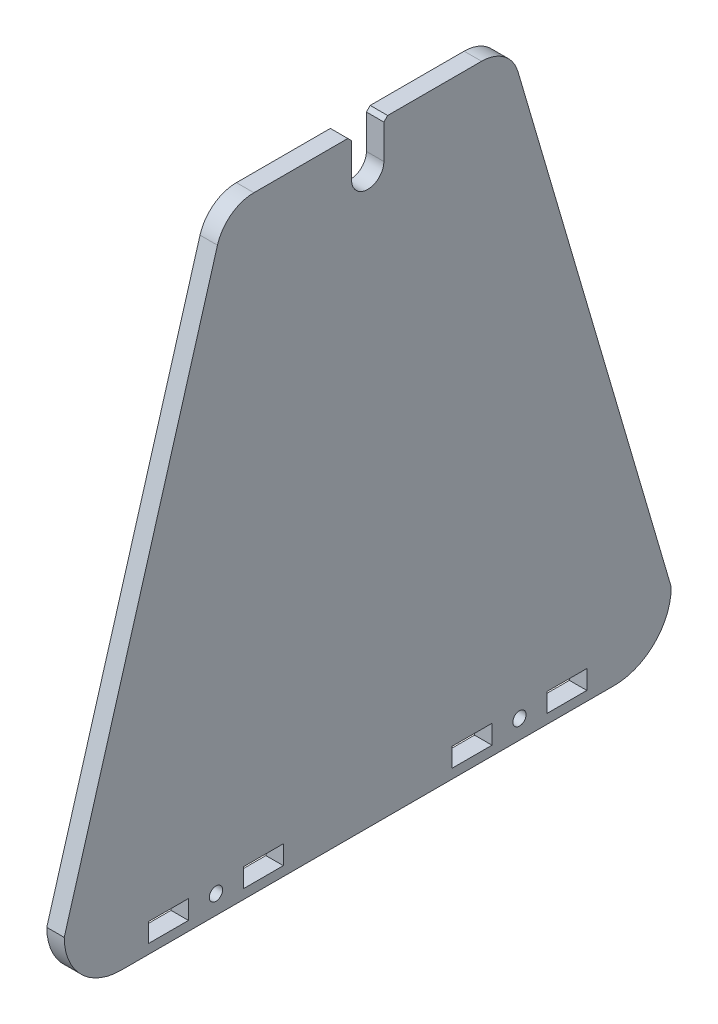
ISO-10303-21;
HEADER;
FILE_DESCRIPTION(('STEP AP214'),'2;1');
FILE_NAME('part.step','',(''),(''),'','','');
FILE_SCHEMA(('AUTOMOTIVE_DESIGN { 1 0 10303 214 1 1 1 1 }'));
ENDSEC;
DATA;
#1=APPLICATION_CONTEXT('core data for automotive mechanical design processes');
#2=APPLICATION_PROTOCOL_DEFINITION('international standard','automotive_design',2000,#1);
#3=PRODUCT_CONTEXT('',#1,'mechanical');
#4=PRODUCT('Part','Part','',(#3));
#5=PRODUCT_RELATED_PRODUCT_CATEGORY('part','',(#4));
#6=PRODUCT_DEFINITION_FORMATION('','',#4);
#7=PRODUCT_DEFINITION_CONTEXT('part definition',#1,'design');
#8=PRODUCT_DEFINITION('design','',#6,#7);
#9=PRODUCT_DEFINITION_SHAPE('','',#8);
#10=(LENGTH_UNIT() NAMED_UNIT(*) SI_UNIT(.MILLI.,.METRE.));
#11=(NAMED_UNIT(*) PLANE_ANGLE_UNIT() SI_UNIT($,.RADIAN.));
#12=(NAMED_UNIT(*) SI_UNIT($,.STERADIAN.) SOLID_ANGLE_UNIT());
#13=UNCERTAINTY_MEASURE_WITH_UNIT(LENGTH_MEASURE(1.E-05),#10,'distance_accuracy_value','');
#14=(GEOMETRIC_REPRESENTATION_CONTEXT(3) GLOBAL_UNCERTAINTY_ASSIGNED_CONTEXT((#13)) GLOBAL_UNIT_ASSIGNED_CONTEXT((#10,
#11,#12)) REPRESENTATION_CONTEXT('',''));
#15=CARTESIAN_POINT('',(0.,0.,0.));
#16=DIRECTION('',(0.,0.,1.));
#17=DIRECTION('',(1.,0.,0.));
#18=AXIS2_PLACEMENT_3D('',#15,#16,#17);
#19=CARTESIAN_POINT('',(4.6,19.9939194911048,-20.0034113777652));
#20=DIRECTION('',(1.,0.,0.));
#21=DIRECTION('',(0.,0.,-1.));
#22=AXIS2_PLACEMENT_3D('',#19,#20,#21);
#23=PLANE('',#22);
#24=DIRECTION('',(0.,0.,-1.));
#25=VECTOR('',#24,1.);
#26=CARTESIAN_POINT('',(4.6,7.49391949110479,-107.253411377765));
#27=LINE('',#26,#25);
#28=CARTESIAN_POINT('',(4.6,7.49391949110479,-107.253411377765));
#29=VERTEX_POINT('',#28);
#30=CARTESIAN_POINT('',(4.6,7.49391949110479,-117.753411377765));
#31=VERTEX_POINT('',#30);
#32=EDGE_CURVE('E239',#29,#31,#27,.T.);
#33=ORIENTED_EDGE('',*,*,#32,.F.);
#34=DIRECTION('',(0.,-1.,0.));
#35=VECTOR('',#34,1.);
#36=CARTESIAN_POINT('',(4.6,12.4939194911048,-107.253411377765));
#37=LINE('',#36,#35);
#38=CARTESIAN_POINT('',(4.6,12.4939194911048,-107.253411377765));
#39=VERTEX_POINT('',#38);
#40=EDGE_CURVE('E231',#39,#29,#37,.T.);
#41=ORIENTED_EDGE('',*,*,#40,.F.);
#42=DIRECTION('',(0.,0.,1.));
#43=VECTOR('',#42,1.);
#44=CARTESIAN_POINT('',(4.6,12.4939194911048,-117.753411377765));
#45=LINE('',#44,#43);
#46=CARTESIAN_POINT('',(4.6,12.4939194911048,-117.753411377765));
#47=VERTEX_POINT('',#46);
#48=EDGE_CURVE('E254',#47,#39,#45,.T.);
#49=ORIENTED_EDGE('',*,*,#48,.F.);
#50=DIRECTION('',(0.,1.,0.));
#51=VECTOR('',#50,1.);
#52=CARTESIAN_POINT('',(4.6,7.49391949110479,-117.753411377765));
#53=LINE('',#52,#51);
#54=EDGE_CURVE('E252',#31,#47,#53,.T.);
#55=ORIENTED_EDGE('',*,*,#54,.F.);
#56=EDGE_LOOP('',(#33,#41,#49,#55));
#57=FACE_BOUND('',#56,.T.);
#58=CARTESIAN_POINT('',(4.6,9.99391949110479,-45.0034113777653));
#59=DIRECTION('',(1.,0.,0.));
#60=DIRECTION('',(0.,0.,-1.));
#61=AXIS2_PLACEMENT_3D('',#58,#59,#60);
#62=CIRCLE('',#61,1.75);
#63=CARTESIAN_POINT('',(4.6,9.99391949110479,-46.7534113777653));
#64=VERTEX_POINT('',#63);
#65=EDGE_CURVE('E301',#64,#64,#62,.T.);
#66=ORIENTED_EDGE('',*,*,#65,.F.);
#67=EDGE_LOOP('',(#66));
#68=FACE_BOUND('',#67,.T.);
#69=DIRECTION('',(0.,0.,-1.));
#70=VECTOR('',#69,1.);
#71=CARTESIAN_POINT('',(4.6,7.49391949110479,-27.2534113777653));
#72=LINE('',#71,#70);
#73=CARTESIAN_POINT('',(4.6,7.49391949110479,-27.2534113777653));
#74=VERTEX_POINT('',#73);
#75=CARTESIAN_POINT('',(4.6,7.49391949110479,-37.7534113777653));
#76=VERTEX_POINT('',#75);
#77=EDGE_CURVE('E340',#74,#76,#72,.T.);
#78=ORIENTED_EDGE('',*,*,#77,.F.);
#79=DIRECTION('',(0.,-1.,0.));
#80=VECTOR('',#79,1.);
#81=CARTESIAN_POINT('',(4.6,12.4939194911048,-27.2534113777653));
#82=LINE('',#81,#80);
#83=CARTESIAN_POINT('',(4.6,12.4939194911048,-27.2534113777653));
#84=VERTEX_POINT('',#83);
#85=EDGE_CURVE('E338',#84,#74,#82,.T.);
#86=ORIENTED_EDGE('',*,*,#85,.F.);
#87=DIRECTION('',(0.,0.,1.));
#88=VECTOR('',#87,1.);
#89=CARTESIAN_POINT('',(4.6,12.4939194911048,-37.7534113777653));
#90=LINE('',#89,#88);
#91=CARTESIAN_POINT('',(4.6,12.4939194911048,-37.7534113777653));
#92=VERTEX_POINT('',#91);
#93=EDGE_CURVE('E346',#92,#84,#90,.T.);
#94=ORIENTED_EDGE('',*,*,#93,.F.);
#95=DIRECTION('',(0.,1.,0.));
#96=VECTOR('',#95,1.);
#97=CARTESIAN_POINT('',(4.6,7.49391949110479,-37.7534113777653));
#98=LINE('',#97,#96);
#99=EDGE_CURVE('E343',#76,#92,#98,.T.);
#100=ORIENTED_EDGE('',*,*,#99,.F.);
#101=EDGE_LOOP('',(#78,#86,#94,#100));
#102=FACE_BOUND('',#101,.T.);
#103=CARTESIAN_POINT('',(4.6,19.9939194911048,-20.0034113777652));
#104=DIRECTION('',(1.,0.,0.));
#105=DIRECTION('',(0.,0.,-1.));
#106=AXIS2_PLACEMENT_3D('',#103,#104,#105);
#107=CIRCLE('',#106,15.);
#108=CARTESIAN_POINT('',(4.6,19.9939194911048,-5.00341137776519));
#109=VERTEX_POINT('',#108);
#110=CARTESIAN_POINT('',(4.6,4.99391949110479,-20.0034113777652));
#111=VERTEX_POINT('',#110);
#112=EDGE_CURVE('E369',#109,#111,#107,.T.);
#113=ORIENTED_EDGE('',*,*,#112,.T.);
#114=DIRECTION('',(0.,0.,-1.));
#115=VECTOR('',#114,1.);
#116=CARTESIAN_POINT('',(4.6,4.99391949110479,-20.0034113777652));
#117=LINE('',#116,#115);
#118=CARTESIAN_POINT('',(4.6,4.99391949110478,-150.003411377766));
#119=VERTEX_POINT('',#118);
#120=EDGE_CURVE('E372',#111,#119,#117,.T.);
#121=ORIENTED_EDGE('',*,*,#120,.T.);
#122=CARTESIAN_POINT('',(4.6,19.9939194911048,-150.003411377766));
#123=DIRECTION('',(1.,0.,0.));
#124=DIRECTION('',(0.,0.,-1.));
#125=AXIS2_PLACEMENT_3D('',#122,#123,#124);
#126=CIRCLE('',#125,15.);
#127=CARTESIAN_POINT('',(4.6,19.9939194911048,-165.003411377766));
#128=VERTEX_POINT('',#127);
#129=EDGE_CURVE('E375',#119,#128,#126,.T.);
#130=ORIENTED_EDGE('',*,*,#129,.T.);
#131=DIRECTION('',(0.,0.959628543885213,0.281270435276702));
#132=VECTOR('',#131,1.);
#133=CARTESIAN_POINT('',(4.6,19.9939194911048,-165.003411377766));
#134=LINE('',#133,#132);
#135=CARTESIAN_POINT('',(4.6,157.806623843872,-124.610032515747));
#136=VERTEX_POINT('',#135);
#137=EDGE_CURVE('E377',#128,#136,#134,.T.);
#138=ORIENTED_EDGE('',*,*,#137,.T.);
#139=CARTESIAN_POINT('',(4.6,154.993919491105,-115.013747076895));
#140=DIRECTION('',(1.,0.,0.));
#141=DIRECTION('',(0.,0.,-1.));
#142=AXIS2_PLACEMENT_3D('',#139,#140,#141);
#143=CIRCLE('',#142,9.99999999999996);
#144=CARTESIAN_POINT('',(4.6,164.993919491105,-115.013747076895));
#145=VERTEX_POINT('',#144);
#146=EDGE_CURVE('E379',#136,#145,#143,.T.);
#147=ORIENTED_EDGE('',*,*,#146,.T.);
#148=DIRECTION('',(0.,0.,1.));
#149=VECTOR('',#148,1.);
#150=CARTESIAN_POINT('',(4.6,164.993919491105,-115.013747076895));
#151=LINE('',#150,#149);
#152=CARTESIAN_POINT('',(4.6,164.993919491105,-90.2534113777653));
#153=VERTEX_POINT('',#152);
#154=EDGE_CURVE('E381',#145,#153,#151,.T.);
#155=ORIENTED_EDGE('',*,*,#154,.T.);
#156=DIRECTION('',(0.,-0.707106781186547,0.707106781186547));
#157=VECTOR('',#156,1.);
#158=CARTESIAN_POINT('',(4.6,164.993919491105,-90.2534113777653));
#159=LINE('',#158,#157);
#160=CARTESIAN_POINT('',(4.6,163.993919491105,-89.2534113777653));
#161=VERTEX_POINT('',#160);
#162=EDGE_CURVE('E383',#153,#161,#159,.T.);
#163=ORIENTED_EDGE('',*,*,#162,.T.);
#164=DIRECTION('',(0.,-1.,0.));
#165=VECTOR('',#164,1.);
#166=CARTESIAN_POINT('',(4.6,163.993919491105,-89.2534113777653));
#167=LINE('',#166,#165);
#168=CARTESIAN_POINT('',(4.6,154.993919491105,-89.2534113777653));
#169=VERTEX_POINT('',#168);
#170=EDGE_CURVE('E385',#161,#169,#167,.T.);
#171=ORIENTED_EDGE('',*,*,#170,.T.);
#172=CARTESIAN_POINT('',(4.6,154.993919491105,-85.0034113777653));
#173=DIRECTION('',(-1.,0.,0.));
#174=DIRECTION('',(0.,0.,-1.));
#175=AXIS2_PLACEMENT_3D('',#172,#173,#174);
#176=CIRCLE('',#175,4.25);
#177=CARTESIAN_POINT('',(4.6,154.993919491105,-80.7534113777653));
#178=VERTEX_POINT('',#177);
#179=EDGE_CURVE('E387',#169,#178,#176,.T.);
#180=ORIENTED_EDGE('',*,*,#179,.T.);
#181=DIRECTION('',(0.,1.,0.));
#182=VECTOR('',#181,1.);
#183=CARTESIAN_POINT('',(4.6,154.993919491105,-80.7534113777653));
#184=LINE('',#183,#182);
#185=CARTESIAN_POINT('',(4.6,163.993919491105,-80.7534113777653));
#186=VERTEX_POINT('',#185);
#187=EDGE_CURVE('E389',#178,#186,#184,.T.);
#188=ORIENTED_EDGE('',*,*,#187,.T.);
#189=DIRECTION('',(0.,0.707106781186547,0.707106781186547));
#190=VECTOR('',#189,1.);
#191=CARTESIAN_POINT('',(4.6,163.993919491105,-80.7534113777653));
#192=LINE('',#191,#190);
#193=CARTESIAN_POINT('',(4.6,164.993919491105,-79.7534113777653));
#194=VERTEX_POINT('',#193);
#195=EDGE_CURVE('E391',#186,#194,#192,.T.);
#196=ORIENTED_EDGE('',*,*,#195,.T.);
#197=DIRECTION('',(0.,0.,1.));
#198=VECTOR('',#197,1.);
#199=CARTESIAN_POINT('',(4.6,164.993919491105,-79.7534113777653));
#200=LINE('',#199,#198);
#201=CARTESIAN_POINT('',(4.6,164.993919491105,-54.9930756786353));
#202=VERTEX_POINT('',#201);
#203=EDGE_CURVE('E393',#194,#202,#200,.T.);
#204=ORIENTED_EDGE('',*,*,#203,.T.);
#205=CARTESIAN_POINT('',(4.6,154.993919491105,-54.9930756786353));
#206=DIRECTION('',(1.,0.,0.));
#207=DIRECTION('',(0.,0.,-1.));
#208=AXIS2_PLACEMENT_3D('',#205,#206,#207);
#209=CIRCLE('',#208,9.99999999999996);
#210=CARTESIAN_POINT('',(4.6,157.806623843872,-45.3967902397832));
#211=VERTEX_POINT('',#210);
#212=EDGE_CURVE('E395',#202,#211,#209,.T.);
#213=ORIENTED_EDGE('',*,*,#212,.T.);
#214=DIRECTION('',(0.,-0.959628543885213,0.281270435276702));
#215=VECTOR('',#214,1.);
#216=CARTESIAN_POINT('',(4.6,157.806623843872,-45.3967902397832));
#217=LINE('',#216,#215);
#218=EDGE_CURVE('E397',#211,#109,#217,.T.);
#219=ORIENTED_EDGE('',*,*,#218,.T.);
#220=EDGE_LOOP('',(#113,#121,#130,#138,#147,#155,#163,#171,#180,#188,#196,#204,#213,#219));
#221=FACE_BOUND('',#220,.T.);
#222=DIRECTION('',(0.,0.,1.));
#223=VECTOR('',#222,1.);
#224=CARTESIAN_POINT('',(4.6,12.4939194911048,-52.2534113777653));
#225=LINE('',#224,#223);
#226=CARTESIAN_POINT('',(4.6,12.4939194911048,-62.7534113777653));
#227=VERTEX_POINT('',#226);
#228=CARTESIAN_POINT('',(4.6,12.4939194911048,-52.2534113777653));
#229=VERTEX_POINT('',#228);
#230=EDGE_CURVE('E309',#227,#229,#225,.T.);
#231=ORIENTED_EDGE('',*,*,#230,.F.);
#232=DIRECTION('',(0.,1.,0.));
#233=VECTOR('',#232,1.);
#234=CARTESIAN_POINT('',(4.6,12.4939194911048,-62.7534113777653));
#235=LINE('',#234,#233);
#236=CARTESIAN_POINT('',(4.6,7.49391949110479,-62.7534113777653));
#237=VERTEX_POINT('',#236);
#238=EDGE_CURVE('E307',#237,#227,#235,.T.);
#239=ORIENTED_EDGE('',*,*,#238,.F.);
#240=DIRECTION('',(0.,0.,-1.));
#241=VECTOR('',#240,1.);
#242=CARTESIAN_POINT('',(4.6,7.49391949110479,-62.7534113777653));
#243=LINE('',#242,#241);
#244=CARTESIAN_POINT('',(4.6,7.49391949110479,-52.2534113777653));
#245=VERTEX_POINT('',#244);
#246=EDGE_CURVE('E315',#245,#237,#243,.T.);
#247=ORIENTED_EDGE('',*,*,#246,.F.);
#248=DIRECTION('',(0.,-1.,0.));
#249=VECTOR('',#248,1.);
#250=CARTESIAN_POINT('',(4.6,7.49391949110479,-52.2534113777653));
#251=LINE('',#250,#249);
#252=EDGE_CURVE('E312',#229,#245,#251,.T.);
#253=ORIENTED_EDGE('',*,*,#252,.F.);
#254=EDGE_LOOP('',(#231,#239,#247,#253));
#255=FACE_BOUND('',#254,.T.);
#256=DIRECTION('',(0.,0.,1.));
#257=VECTOR('',#256,1.);
#258=CARTESIAN_POINT('',(4.6,12.4939194911048,-132.253411377765));
#259=LINE('',#258,#257);
#260=CARTESIAN_POINT('',(4.6,12.4939194911048,-142.753411377765));
#261=VERTEX_POINT('',#260);
#262=CARTESIAN_POINT('',(4.6,12.4939194911048,-132.253411377765));
#263=VERTEX_POINT('',#262);
#264=EDGE_CURVE('E272',#261,#263,#259,.T.);
#265=ORIENTED_EDGE('',*,*,#264,.F.);
#266=DIRECTION('',(0.,1.,0.));
#267=VECTOR('',#266,1.);
#268=CARTESIAN_POINT('',(4.6,12.4939194911048,-142.753411377765));
#269=LINE('',#268,#267);
#270=CARTESIAN_POINT('',(4.6,7.49391949110479,-142.753411377765));
#271=VERTEX_POINT('',#270);
#272=EDGE_CURVE('E270',#271,#261,#269,.T.);
#273=ORIENTED_EDGE('',*,*,#272,.F.);
#274=DIRECTION('',(0.,0.,-1.));
#275=VECTOR('',#274,1.);
#276=CARTESIAN_POINT('',(4.6,7.49391949110479,-142.753411377765));
#277=LINE('',#276,#275);
#278=CARTESIAN_POINT('',(4.6,7.49391949110479,-132.253411377765));
#279=VERTEX_POINT('',#278);
#280=EDGE_CURVE('E278',#279,#271,#277,.T.);
#281=ORIENTED_EDGE('',*,*,#280,.F.);
#282=DIRECTION('',(0.,-1.,0.));
#283=VECTOR('',#282,1.);
#284=CARTESIAN_POINT('',(4.6,7.49391949110479,-132.253411377765));
#285=LINE('',#284,#283);
#286=EDGE_CURVE('E275',#263,#279,#285,.T.);
#287=ORIENTED_EDGE('',*,*,#286,.F.);
#288=EDGE_LOOP('',(#265,#273,#281,#287));
#289=FACE_BOUND('',#288,.T.);
#290=CARTESIAN_POINT('',(4.6,9.99391949110479,-125.003411377765));
#291=DIRECTION('',(1.,0.,0.));
#292=DIRECTION('',(0.,0.,-1.));
#293=AXIS2_PLACEMENT_3D('',#290,#291,#292);
#294=CIRCLE('',#293,1.75);
#295=CARTESIAN_POINT('',(4.6,9.99391949110479,-126.753411377765));
#296=VERTEX_POINT('',#295);
#297=EDGE_CURVE('E260',#296,#296,#294,.T.);
#298=ORIENTED_EDGE('',*,*,#297,.F.);
#299=EDGE_LOOP('',(#298));
#300=FACE_BOUND('',#299,.T.);
#301=ADVANCED_FACE('F34',(#57,#68,#102,#221,#255,#289,#300),#23,.T.);
#302=CARTESIAN_POINT('',(0.,19.9939194911048,-20.0034113777652));
#303=DIRECTION('',(1.,0.,0.));
#304=DIRECTION('',(0.,0.,-1.));
#305=AXIS2_PLACEMENT_3D('',#302,#303,#304);
#306=PLANE('',#305);
#307=DIRECTION('',(0.,-1.,0.));
#308=VECTOR('',#307,1.);
#309=CARTESIAN_POINT('',(0.,12.4939194911048,-107.253411377765));
#310=LINE('',#309,#308);
#311=CARTESIAN_POINT('',(0.,12.4939194911048,-107.253411377765));
#312=VERTEX_POINT('',#311);
#313=CARTESIAN_POINT('',(0.,7.49391949110479,-107.253411377765));
#314=VERTEX_POINT('',#313);
#315=EDGE_CURVE('E57',#312,#314,#310,.T.);
#316=ORIENTED_EDGE('',*,*,#315,.T.);
#317=DIRECTION('',(0.,0.,-1.));
#318=VECTOR('',#317,1.);
#319=CARTESIAN_POINT('',(0.,7.49391949110479,-107.253411377765));
#320=LINE('',#319,#318);
#321=CARTESIAN_POINT('',(0.,7.49391949110479,-117.753411377765));
#322=VERTEX_POINT('',#321);
#323=EDGE_CURVE('E246',#314,#322,#320,.T.);
#324=ORIENTED_EDGE('',*,*,#323,.T.);
#325=DIRECTION('',(0.,1.,0.));
#326=VECTOR('',#325,1.);
#327=CARTESIAN_POINT('',(0.,7.49391949110479,-117.753411377765));
#328=LINE('',#327,#326);
#329=CARTESIAN_POINT('',(0.,12.4939194911048,-117.753411377765));
#330=VERTEX_POINT('',#329);
#331=EDGE_CURVE('E262',#322,#330,#328,.T.);
#332=ORIENTED_EDGE('',*,*,#331,.T.);
#333=DIRECTION('',(0.,0.,1.));
#334=VECTOR('',#333,1.);
#335=CARTESIAN_POINT('',(0.,12.4939194911048,-117.753411377765));
#336=LINE('',#335,#334);
#337=EDGE_CURVE('E240',#330,#312,#336,.T.);
#338=ORIENTED_EDGE('',*,*,#337,.T.);
#339=EDGE_LOOP('',(#316,#324,#332,#338));
#340=FACE_BOUND('',#339,.T.);
#341=CARTESIAN_POINT('',(0.,9.99391949110479,-45.0034113777653));
#342=DIRECTION('',(1.,0.,0.));
#343=DIRECTION('',(0.,0.,-1.));
#344=AXIS2_PLACEMENT_3D('',#341,#342,#343);
#345=CIRCLE('',#344,1.75);
#346=CARTESIAN_POINT('',(0.,9.99391949110479,-46.7534113777653));
#347=VERTEX_POINT('',#346);
#348=EDGE_CURVE('E300',#347,#347,#345,.T.);
#349=ORIENTED_EDGE('',*,*,#348,.T.);
#350=EDGE_LOOP('',(#349));
#351=FACE_BOUND('',#350,.T.);
#352=DIRECTION('',(0.,-1.,0.));
#353=VECTOR('',#352,1.);
#354=CARTESIAN_POINT('',(0.,12.4939194911048,-27.2534113777653));
#355=LINE('',#354,#353);
#356=CARTESIAN_POINT('',(0.,12.4939194911048,-27.2534113777653));
#357=VERTEX_POINT('',#356);
#358=CARTESIAN_POINT('',(0.,7.49391949110479,-27.2534113777653));
#359=VERTEX_POINT('',#358);
#360=EDGE_CURVE('E337',#357,#359,#355,.T.);
#361=ORIENTED_EDGE('',*,*,#360,.T.);
#362=DIRECTION('',(0.,0.,-1.));
#363=VECTOR('',#362,1.);
#364=CARTESIAN_POINT('',(0.,7.49391949110479,-27.2534113777653));
#365=LINE('',#364,#363);
#366=CARTESIAN_POINT('',(0.,7.49391949110479,-37.7534113777653));
#367=VERTEX_POINT('',#366);
#368=EDGE_CURVE('E351',#359,#367,#365,.T.);
#369=ORIENTED_EDGE('',*,*,#368,.T.);
#370=DIRECTION('',(0.,1.,0.));
#371=VECTOR('',#370,1.);
#372=CARTESIAN_POINT('',(0.,7.49391949110479,-37.7534113777653));
#373=LINE('',#372,#371);
#374=CARTESIAN_POINT('',(0.,12.4939194911048,-37.7534113777653));
#375=VERTEX_POINT('',#374);
#376=EDGE_CURVE('E354',#367,#375,#373,.T.);
#377=ORIENTED_EDGE('',*,*,#376,.T.);
#378=DIRECTION('',(0.,0.,1.));
#379=VECTOR('',#378,1.);
#380=CARTESIAN_POINT('',(0.,12.4939194911048,-37.7534113777653));
#381=LINE('',#380,#379);
#382=EDGE_CURVE('E341',#375,#357,#381,.T.);
#383=ORIENTED_EDGE('',*,*,#382,.T.);
#384=EDGE_LOOP('',(#361,#369,#377,#383));
#385=FACE_BOUND('',#384,.T.);
#386=CARTESIAN_POINT('',(0.,19.9939194911048,-20.0034113777652));
#387=DIRECTION('',(1.,0.,0.));
#388=DIRECTION('',(0.,0.,-1.));
#389=AXIS2_PLACEMENT_3D('',#386,#387,#388);
#390=CIRCLE('',#389,15.);
#391=CARTESIAN_POINT('',(0.,19.9939194911048,-5.00341137776519));
#392=VERTEX_POINT('',#391);
#393=CARTESIAN_POINT('',(0.,4.99391949110479,-20.0034113777652));
#394=VERTEX_POINT('',#393);
#395=EDGE_CURVE('E368',#392,#394,#390,.T.);
#396=ORIENTED_EDGE('',*,*,#395,.F.);
#397=DIRECTION('',(0.,-0.959628543885213,0.281270435276702));
#398=VECTOR('',#397,1.);
#399=CARTESIAN_POINT('',(0.,157.806623843872,-45.3967902397832));
#400=LINE('',#399,#398);
#401=CARTESIAN_POINT('',(0.,157.806623843872,-45.3967902397832));
#402=VERTEX_POINT('',#401);
#403=EDGE_CURVE('E373',#402,#392,#400,.T.);
#404=ORIENTED_EDGE('',*,*,#403,.F.);
#405=CARTESIAN_POINT('',(0.,154.993919491105,-54.9930756786353));
#406=DIRECTION('',(1.,0.,0.));
#407=DIRECTION('',(0.,0.,-1.));
#408=AXIS2_PLACEMENT_3D('',#405,#406,#407);
#409=CIRCLE('',#408,9.99999999999996);
#410=CARTESIAN_POINT('',(0.,164.993919491105,-54.9930756786353));
#411=VERTEX_POINT('',#410);
#412=EDGE_CURVE('E424',#411,#402,#409,.T.);
#413=ORIENTED_EDGE('',*,*,#412,.F.);
#414=DIRECTION('',(0.,0.,1.));
#415=VECTOR('',#414,1.);
#416=CARTESIAN_POINT('',(0.,164.993919491105,-79.7534113777653));
#417=LINE('',#416,#415);
#418=CARTESIAN_POINT('',(0.,164.993919491105,-79.7534113777653));
#419=VERTEX_POINT('',#418);
#420=EDGE_CURVE('E422',#419,#411,#417,.T.);
#421=ORIENTED_EDGE('',*,*,#420,.F.);
#422=DIRECTION('',(0.,0.707106781186547,0.707106781186547));
#423=VECTOR('',#422,1.);
#424=CARTESIAN_POINT('',(0.,163.993919491105,-80.7534113777653));
#425=LINE('',#424,#423);
#426=CARTESIAN_POINT('',(0.,163.993919491105,-80.7534113777653));
#427=VERTEX_POINT('',#426);
#428=EDGE_CURVE('E420',#427,#419,#425,.T.);
#429=ORIENTED_EDGE('',*,*,#428,.F.);
#430=DIRECTION('',(0.,1.,0.));
#431=VECTOR('',#430,1.);
#432=CARTESIAN_POINT('',(0.,154.993919491105,-80.7534113777653));
#433=LINE('',#432,#431);
#434=CARTESIAN_POINT('',(0.,154.993919491105,-80.7534113777653));
#435=VERTEX_POINT('',#434);
#436=EDGE_CURVE('E418',#435,#427,#433,.T.);
#437=ORIENTED_EDGE('',*,*,#436,.F.);
#438=CARTESIAN_POINT('',(0.,154.993919491105,-85.0034113777653));
#439=DIRECTION('',(-1.,0.,0.));
#440=DIRECTION('',(0.,0.,-1.));
#441=AXIS2_PLACEMENT_3D('',#438,#439,#440);
#442=CIRCLE('',#441,4.25);
#443=CARTESIAN_POINT('',(0.,154.993919491105,-89.2534113777653));
#444=VERTEX_POINT('',#443);
#445=EDGE_CURVE('E416',#444,#435,#442,.T.);
#446=ORIENTED_EDGE('',*,*,#445,.F.);
#447=DIRECTION('',(0.,-1.,0.));
#448=VECTOR('',#447,1.);
#449=CARTESIAN_POINT('',(0.,163.993919491105,-89.2534113777653));
#450=LINE('',#449,#448);
#451=CARTESIAN_POINT('',(0.,163.993919491105,-89.2534113777653));
#452=VERTEX_POINT('',#451);
#453=EDGE_CURVE('E414',#452,#444,#450,.T.);
#454=ORIENTED_EDGE('',*,*,#453,.F.);
#455=DIRECTION('',(0.,-0.707106781186547,0.707106781186547));
#456=VECTOR('',#455,1.);
#457=CARTESIAN_POINT('',(0.,164.993919491105,-90.2534113777653));
#458=LINE('',#457,#456);
#459=CARTESIAN_POINT('',(0.,164.993919491105,-90.2534113777653));
#460=VERTEX_POINT('',#459);
#461=EDGE_CURVE('E412',#460,#452,#458,.T.);
#462=ORIENTED_EDGE('',*,*,#461,.F.);
#463=DIRECTION('',(0.,0.,1.));
#464=VECTOR('',#463,1.);
#465=CARTESIAN_POINT('',(0.,164.993919491105,-115.013747076895));
#466=LINE('',#465,#464);
#467=CARTESIAN_POINT('',(0.,164.993919491105,-115.013747076895));
#468=VERTEX_POINT('',#467);
#469=EDGE_CURVE('E410',#468,#460,#466,.T.);
#470=ORIENTED_EDGE('',*,*,#469,.F.);
#471=CARTESIAN_POINT('',(0.,154.993919491105,-115.013747076895));
#472=DIRECTION('',(1.,0.,0.));
#473=DIRECTION('',(0.,0.,-1.));
#474=AXIS2_PLACEMENT_3D('',#471,#472,#473);
#475=CIRCLE('',#474,9.99999999999996);
#476=CARTESIAN_POINT('',(0.,157.806623843872,-124.610032515747));
#477=VERTEX_POINT('',#476);
#478=EDGE_CURVE('E408',#477,#468,#475,.T.);
#479=ORIENTED_EDGE('',*,*,#478,.F.);
#480=DIRECTION('',(0.,0.959628543885213,0.281270435276702));
#481=VECTOR('',#480,1.);
#482=CARTESIAN_POINT('',(0.,19.9939194911048,-165.003411377766));
#483=LINE('',#482,#481);
#484=CARTESIAN_POINT('',(0.,19.9939194911048,-165.003411377766));
#485=VERTEX_POINT('',#484);
#486=EDGE_CURVE('E406',#485,#477,#483,.T.);
#487=ORIENTED_EDGE('',*,*,#486,.F.);
#488=CARTESIAN_POINT('',(0.,19.9939194911048,-150.003411377766));
#489=DIRECTION('',(1.,0.,0.));
#490=DIRECTION('',(0.,0.,-1.));
#491=AXIS2_PLACEMENT_3D('',#488,#489,#490);
#492=CIRCLE('',#491,15.);
#493=CARTESIAN_POINT('',(0.,4.99391949110478,-150.003411377766));
#494=VERTEX_POINT('',#493);
#495=EDGE_CURVE('E404',#494,#485,#492,.T.);
#496=ORIENTED_EDGE('',*,*,#495,.F.);
#497=DIRECTION('',(0.,0.,-1.));
#498=VECTOR('',#497,1.);
#499=CARTESIAN_POINT('',(0.,4.99391949110479,-20.0034113777652));
#500=LINE('',#499,#498);
#501=EDGE_CURVE('E402',#394,#494,#500,.T.);
#502=ORIENTED_EDGE('',*,*,#501,.F.);
#503=EDGE_LOOP('',(#396,#404,#413,#421,#429,#437,#446,#454,#462,#470,#479,#487,#496,#502));
#504=FACE_BOUND('',#503,.T.);
#505=DIRECTION('',(0.,1.,0.));
#506=VECTOR('',#505,1.);
#507=CARTESIAN_POINT('',(0.,12.4939194911048,-62.7534113777653));
#508=LINE('',#507,#506);
#509=CARTESIAN_POINT('',(0.,7.49391949110479,-62.7534113777653));
#510=VERTEX_POINT('',#509);
#511=CARTESIAN_POINT('',(0.,12.4939194911048,-62.7534113777653));
#512=VERTEX_POINT('',#511);
#513=EDGE_CURVE('E304',#510,#512,#508,.T.);
#514=ORIENTED_EDGE('',*,*,#513,.T.);
#515=DIRECTION('',(0.,0.,1.));
#516=VECTOR('',#515,1.);
#517=CARTESIAN_POINT('',(0.,12.4939194911048,-52.2534113777653));
#518=LINE('',#517,#516);
#519=CARTESIAN_POINT('',(0.,12.4939194911048,-52.2534113777653));
#520=VERTEX_POINT('',#519);
#521=EDGE_CURVE('E320',#512,#520,#518,.T.);
#522=ORIENTED_EDGE('',*,*,#521,.T.);
#523=DIRECTION('',(0.,-1.,0.));
#524=VECTOR('',#523,1.);
#525=CARTESIAN_POINT('',(0.,7.49391949110479,-52.2534113777653));
#526=LINE('',#525,#524);
#527=CARTESIAN_POINT('',(0.,7.49391949110479,-52.2534113777653));
#528=VERTEX_POINT('',#527);
#529=EDGE_CURVE('E323',#520,#528,#526,.T.);
#530=ORIENTED_EDGE('',*,*,#529,.T.);
#531=DIRECTION('',(0.,0.,-1.));
#532=VECTOR('',#531,1.);
#533=CARTESIAN_POINT('',(0.,7.49391949110479,-62.7534113777653));
#534=LINE('',#533,#532);
#535=EDGE_CURVE('E310',#528,#510,#534,.T.);
#536=ORIENTED_EDGE('',*,*,#535,.T.);
#537=EDGE_LOOP('',(#514,#522,#530,#536));
#538=FACE_BOUND('',#537,.T.);
#539=DIRECTION('',(0.,1.,0.));
#540=VECTOR('',#539,1.);
#541=CARTESIAN_POINT('',(0.,12.4939194911048,-142.753411377765));
#542=LINE('',#541,#540);
#543=CARTESIAN_POINT('',(0.,7.49391949110479,-142.753411377765));
#544=VERTEX_POINT('',#543);
#545=CARTESIAN_POINT('',(0.,12.4939194911048,-142.753411377765));
#546=VERTEX_POINT('',#545);
#547=EDGE_CURVE('E247',#544,#546,#542,.T.);
#548=ORIENTED_EDGE('',*,*,#547,.T.);
#549=DIRECTION('',(0.,0.,1.));
#550=VECTOR('',#549,1.);
#551=CARTESIAN_POINT('',(0.,12.4939194911048,-132.253411377765));
#552=LINE('',#551,#550);
#553=CARTESIAN_POINT('',(0.,12.4939194911048,-132.253411377765));
#554=VERTEX_POINT('',#553);
#555=EDGE_CURVE('E283',#546,#554,#552,.T.);
#556=ORIENTED_EDGE('',*,*,#555,.T.);
#557=DIRECTION('',(0.,-1.,0.));
#558=VECTOR('',#557,1.);
#559=CARTESIAN_POINT('',(0.,7.49391949110479,-132.253411377765));
#560=LINE('',#559,#558);
#561=CARTESIAN_POINT('',(0.,7.49391949110479,-132.253411377765));
#562=VERTEX_POINT('',#561);
#563=EDGE_CURVE('E286',#554,#562,#560,.T.);
#564=ORIENTED_EDGE('',*,*,#563,.T.);
#565=DIRECTION('',(0.,0.,-1.));
#566=VECTOR('',#565,1.);
#567=CARTESIAN_POINT('',(0.,7.49391949110479,-142.753411377765));
#568=LINE('',#567,#566);
#569=EDGE_CURVE('E273',#562,#544,#568,.T.);
#570=ORIENTED_EDGE('',*,*,#569,.T.);
#571=EDGE_LOOP('',(#548,#556,#564,#570));
#572=FACE_BOUND('',#571,.T.);
#573=CARTESIAN_POINT('',(0.,9.99391949110479,-125.003411377765));
#574=DIRECTION('',(1.,0.,0.));
#575=DIRECTION('',(0.,0.,-1.));
#576=AXIS2_PLACEMENT_3D('',#573,#574,#575);
#577=CIRCLE('',#576,1.75);
#578=CARTESIAN_POINT('',(0.,9.99391949110479,-126.753411377765));
#579=VERTEX_POINT('',#578);
#580=EDGE_CURVE('E841',#579,#579,#577,.T.);
#581=ORIENTED_EDGE('',*,*,#580,.T.);
#582=EDGE_LOOP('',(#581));
#583=FACE_BOUND('',#582,.T.);
#584=ADVANCED_FACE('F472',(#340,#351,#385,#504,#538,#572,#583),#306,.F.);
#585=CARTESIAN_POINT('',(4.6,19.9939194911048,-20.0034113777652));
#586=DIRECTION('',(-1.,0.,0.));
#587=DIRECTION('',(0.,0.,1.));
#588=AXIS2_PLACEMENT_3D('',#585,#586,#587);
#589=CYLINDRICAL_SURFACE('',#588,15.);
#590=ORIENTED_EDGE('',*,*,#395,.T.);
#591=DIRECTION('',(-1.,0.,0.));
#592=VECTOR('',#591,1.);
#593=CARTESIAN_POINT('',(4.6,4.99391949110479,-20.0034113777652));
#594=LINE('',#593,#592);
#595=EDGE_CURVE('E11',#111,#394,#594,.T.);
#596=ORIENTED_EDGE('',*,*,#595,.F.);
#597=ORIENTED_EDGE('',*,*,#112,.F.);
#598=DIRECTION('',(-1.,0.,0.));
#599=VECTOR('',#598,1.);
#600=CARTESIAN_POINT('',(4.6,19.9939194911048,-5.00341137776519));
#601=LINE('',#600,#599);
#602=EDGE_CURVE('E399',#109,#392,#601,.T.);
#603=ORIENTED_EDGE('',*,*,#602,.T.);
#604=EDGE_LOOP('',(#590,#596,#597,#603));
#605=FACE_BOUND('',#604,.T.);
#606=ADVANCED_FACE('F36',(#605),#589,.T.);
#607=CARTESIAN_POINT('',(4.6,4.99391949110479,-20.0034113777652));
#608=DIRECTION('',(0.,1.,0.));
#609=DIRECTION('',(0.,0.,1.));
#610=AXIS2_PLACEMENT_3D('',#607,#608,#609);
#611=PLANE('',#610);
#612=ORIENTED_EDGE('',*,*,#501,.T.);
#613=DIRECTION('',(-1.,0.,0.));
#614=VECTOR('',#613,1.);
#615=CARTESIAN_POINT('',(4.6,4.99391949110478,-150.003411377766));
#616=LINE('',#615,#614);
#617=EDGE_CURVE('E42',#119,#494,#616,.T.);
#618=ORIENTED_EDGE('',*,*,#617,.F.);
#619=ORIENTED_EDGE('',*,*,#120,.F.);
#620=ORIENTED_EDGE('',*,*,#595,.T.);
#621=EDGE_LOOP('',(#612,#618,#619,#620));
#622=FACE_BOUND('',#621,.T.);
#623=ADVANCED_FACE('F490',(#622),#611,.F.);
#624=CARTESIAN_POINT('',(4.6,19.9939194911048,-150.003411377766));
#625=DIRECTION('',(-1.,0.,0.));
#626=DIRECTION('',(0.,0.,1.));
#627=AXIS2_PLACEMENT_3D('',#624,#625,#626);
#628=CYLINDRICAL_SURFACE('',#627,15.);
#629=ORIENTED_EDGE('',*,*,#495,.T.);
#630=DIRECTION('',(-1.,0.,0.));
#631=VECTOR('',#630,1.);
#632=CARTESIAN_POINT('',(4.6,19.9939194911048,-165.003411377766));
#633=LINE('',#632,#631);
#634=EDGE_CURVE('E459',#128,#485,#633,.T.);
#635=ORIENTED_EDGE('',*,*,#634,.F.);
#636=ORIENTED_EDGE('',*,*,#129,.F.);
#637=ORIENTED_EDGE('',*,*,#617,.T.);
#638=EDGE_LOOP('',(#629,#635,#636,#637));
#639=FACE_BOUND('',#638,.T.);
#640=ADVANCED_FACE('F466',(#639),#628,.T.);
#641=CARTESIAN_POINT('',(4.6,19.9939194911048,-165.003411377766));
#642=DIRECTION('',(0.,-0.281270435276702,0.959628543885213));
#643=DIRECTION('',(0.,-0.959628543885213,-0.281270435276702));
#644=AXIS2_PLACEMENT_3D('',#641,#642,#643);
#645=PLANE('',#644);
#646=ORIENTED_EDGE('',*,*,#486,.T.);
#647=DIRECTION('',(-1.,0.,0.));
#648=VECTOR('',#647,1.);
#649=CARTESIAN_POINT('',(4.6,157.806623843872,-124.610032515747));
#650=LINE('',#649,#648);
#651=EDGE_CURVE('E456',#136,#477,#650,.T.);
#652=ORIENTED_EDGE('',*,*,#651,.F.);
#653=ORIENTED_EDGE('',*,*,#137,.F.);
#654=ORIENTED_EDGE('',*,*,#634,.T.);
#655=EDGE_LOOP('',(#646,#652,#653,#654));
#656=FACE_BOUND('',#655,.T.);
#657=ADVANCED_FACE('F478',(#656),#645,.F.);
#658=CARTESIAN_POINT('',(4.6,154.993919491105,-115.013747076895));
#659=DIRECTION('',(-1.,0.,0.));
#660=DIRECTION('',(0.,0.,1.));
#661=AXIS2_PLACEMENT_3D('',#658,#659,#660);
#662=CYLINDRICAL_SURFACE('',#661,9.99999999999996);
#663=ORIENTED_EDGE('',*,*,#478,.T.);
#664=DIRECTION('',(-1.,0.,0.));
#665=VECTOR('',#664,1.);
#666=CARTESIAN_POINT('',(4.6,164.993919491105,-115.013747076895));
#667=LINE('',#666,#665);
#668=EDGE_CURVE('E453',#145,#468,#667,.T.);
#669=ORIENTED_EDGE('',*,*,#668,.F.);
#670=ORIENTED_EDGE('',*,*,#146,.F.);
#671=ORIENTED_EDGE('',*,*,#651,.T.);
#672=EDGE_LOOP('',(#663,#669,#670,#671));
#673=FACE_BOUND('',#672,.T.);
#674=ADVANCED_FACE('F482',(#673),#662,.T.);
#675=CARTESIAN_POINT('',(4.6,164.993919491105,-115.013747076895));
#676=DIRECTION('',(0.,-1.,0.));
#677=DIRECTION('',(0.,0.,-1.));
#678=AXIS2_PLACEMENT_3D('',#675,#676,#677);
#679=PLANE('',#678);
#680=ORIENTED_EDGE('',*,*,#469,.T.);
#681=DIRECTION('',(-1.,0.,0.));
#682=VECTOR('',#681,1.);
#683=CARTESIAN_POINT('',(4.6,164.993919491105,-90.2534113777653));
#684=LINE('',#683,#682);
#685=EDGE_CURVE('E450',#153,#460,#684,.T.);
#686=ORIENTED_EDGE('',*,*,#685,.F.);
#687=ORIENTED_EDGE('',*,*,#154,.F.);
#688=ORIENTED_EDGE('',*,*,#668,.T.);
#689=EDGE_LOOP('',(#680,#686,#687,#688));
#690=FACE_BOUND('',#689,.T.);
#691=ADVANCED_FACE('F533',(#690),#679,.F.);
#692=CARTESIAN_POINT('',(4.6,164.993919491105,-90.2534113777653));
#693=DIRECTION('',(0.,-0.707106781186547,-0.707106781186547));
#694=DIRECTION('',(0.,0.707106781186548,-0.707106781186548));
#695=AXIS2_PLACEMENT_3D('',#692,#693,#694);
#696=PLANE('',#695);
#697=ORIENTED_EDGE('',*,*,#461,.T.);
#698=DIRECTION('',(-1.,0.,0.));
#699=VECTOR('',#698,1.);
#700=CARTESIAN_POINT('',(4.6,163.993919491105,-89.2534113777653));
#701=LINE('',#700,#699);
#702=EDGE_CURVE('E447',#161,#452,#701,.T.);
#703=ORIENTED_EDGE('',*,*,#702,.F.);
#704=ORIENTED_EDGE('',*,*,#162,.F.);
#705=ORIENTED_EDGE('',*,*,#685,.T.);
#706=EDGE_LOOP('',(#697,#703,#704,#705));
#707=FACE_BOUND('',#706,.T.);
#708=ADVANCED_FACE('F531',(#707),#696,.F.);
#709=CARTESIAN_POINT('',(4.6,163.993919491105,-89.2534113777653));
#710=DIRECTION('',(0.,0.,-1.));
#711=DIRECTION('',(-1.,0.,0.));
#712=AXIS2_PLACEMENT_3D('',#709,#710,#711);
#713=PLANE('',#712);
#714=ORIENTED_EDGE('',*,*,#453,.T.);
#715=DIRECTION('',(-1.,0.,0.));
#716=VECTOR('',#715,1.);
#717=CARTESIAN_POINT('',(4.6,154.993919491105,-89.2534113777653));
#718=LINE('',#717,#716);
#719=EDGE_CURVE('E444',#169,#444,#718,.T.);
#720=ORIENTED_EDGE('',*,*,#719,.F.);
#721=ORIENTED_EDGE('',*,*,#170,.F.);
#722=ORIENTED_EDGE('',*,*,#702,.T.);
#723=EDGE_LOOP('',(#714,#720,#721,#722));
#724=FACE_BOUND('',#723,.T.);
#725=ADVANCED_FACE('F526',(#724),#713,.F.);
#726=CARTESIAN_POINT('',(4.6,154.993919491105,-85.0034113777653));
#727=DIRECTION('',(-1.,0.,0.));
#728=DIRECTION('',(0.,0.,1.));
#729=AXIS2_PLACEMENT_3D('',#726,#727,#728);
#730=CYLINDRICAL_SURFACE('',#729,4.25);
#731=ORIENTED_EDGE('',*,*,#445,.T.);
#732=DIRECTION('',(-1.,0.,0.));
#733=VECTOR('',#732,1.);
#734=CARTESIAN_POINT('',(4.6,154.993919491105,-80.7534113777653));
#735=LINE('',#734,#733);
#736=EDGE_CURVE('E441',#178,#435,#735,.T.);
#737=ORIENTED_EDGE('',*,*,#736,.F.);
#738=ORIENTED_EDGE('',*,*,#179,.F.);
#739=ORIENTED_EDGE('',*,*,#719,.T.);
#740=EDGE_LOOP('',(#731,#737,#738,#739));
#741=FACE_BOUND('',#740,.T.);
#742=ADVANCED_FACE('F521',(#741),#730,.F.);
#743=CARTESIAN_POINT('',(4.6,154.993919491105,-80.7534113777653));
#744=DIRECTION('',(0.,0.,1.));
#745=DIRECTION('',(1.,0.,0.));
#746=AXIS2_PLACEMENT_3D('',#743,#744,#745);
#747=PLANE('',#746);
#748=ORIENTED_EDGE('',*,*,#436,.T.);
#749=DIRECTION('',(-1.,0.,0.));
#750=VECTOR('',#749,1.);
#751=CARTESIAN_POINT('',(4.6,163.993919491105,-80.7534113777653));
#752=LINE('',#751,#750);
#753=EDGE_CURVE('E438',#186,#427,#752,.T.);
#754=ORIENTED_EDGE('',*,*,#753,.F.);
#755=ORIENTED_EDGE('',*,*,#187,.F.);
#756=ORIENTED_EDGE('',*,*,#736,.T.);
#757=EDGE_LOOP('',(#748,#754,#755,#756));
#758=FACE_BOUND('',#757,.T.);
#759=ADVANCED_FACE('F517',(#758),#747,.F.);
#760=CARTESIAN_POINT('',(4.6,163.993919491105,-80.7534113777653));
#761=DIRECTION('',(0.,-0.707106781186547,0.707106781186547));
#762=DIRECTION('',(0.,-0.707106781186548,-0.707106781186548));
#763=AXIS2_PLACEMENT_3D('',#760,#761,#762);
#764=PLANE('',#763);
#765=ORIENTED_EDGE('',*,*,#428,.T.);
#766=DIRECTION('',(-1.,0.,0.));
#767=VECTOR('',#766,1.);
#768=CARTESIAN_POINT('',(4.6,164.993919491105,-79.7534113777653));
#769=LINE('',#768,#767);
#770=EDGE_CURVE('E435',#194,#419,#769,.T.);
#771=ORIENTED_EDGE('',*,*,#770,.F.);
#772=ORIENTED_EDGE('',*,*,#195,.F.);
#773=ORIENTED_EDGE('',*,*,#753,.T.);
#774=EDGE_LOOP('',(#765,#771,#772,#773));
#775=FACE_BOUND('',#774,.T.);
#776=ADVANCED_FACE('F512',(#775),#764,.F.);
#777=CARTESIAN_POINT('',(4.6,164.993919491105,-79.7534113777653));
#778=DIRECTION('',(0.,-1.,0.));
#779=DIRECTION('',(0.,0.,-1.));
#780=AXIS2_PLACEMENT_3D('',#777,#778,#779);
#781=PLANE('',#780);
#782=ORIENTED_EDGE('',*,*,#420,.T.);
#783=DIRECTION('',(-1.,0.,0.));
#784=VECTOR('',#783,1.);
#785=CARTESIAN_POINT('',(4.6,164.993919491105,-54.9930756786353));
#786=LINE('',#785,#784);
#787=EDGE_CURVE('E432',#202,#411,#786,.T.);
#788=ORIENTED_EDGE('',*,*,#787,.F.);
#789=ORIENTED_EDGE('',*,*,#203,.F.);
#790=ORIENTED_EDGE('',*,*,#770,.T.);
#791=EDGE_LOOP('',(#782,#788,#789,#790));
#792=FACE_BOUND('',#791,.T.);
#793=ADVANCED_FACE('F506',(#792),#781,.F.);
#794=CARTESIAN_POINT('',(4.6,154.993919491105,-54.9930756786353));
#795=DIRECTION('',(-1.,0.,0.));
#796=DIRECTION('',(0.,0.,1.));
#797=AXIS2_PLACEMENT_3D('',#794,#795,#796);
#798=CYLINDRICAL_SURFACE('',#797,9.99999999999996);
#799=ORIENTED_EDGE('',*,*,#412,.T.);
#800=DIRECTION('',(-1.,0.,0.));
#801=VECTOR('',#800,1.);
#802=CARTESIAN_POINT('',(4.6,157.806623843872,-45.3967902397832));
#803=LINE('',#802,#801);
#804=EDGE_CURVE('E429',#211,#402,#803,.T.);
#805=ORIENTED_EDGE('',*,*,#804,.F.);
#806=ORIENTED_EDGE('',*,*,#212,.F.);
#807=ORIENTED_EDGE('',*,*,#787,.T.);
#808=EDGE_LOOP('',(#799,#805,#806,#807));
#809=FACE_BOUND('',#808,.T.);
#810=ADVANCED_FACE('F502',(#809),#798,.T.);
#811=CARTESIAN_POINT('',(4.6,157.806623843872,-45.3967902397832));
#812=DIRECTION('',(0.,-0.281270435276702,-0.959628543885213));
#813=DIRECTION('',(0.,0.959628543885213,-0.281270435276702));
#814=AXIS2_PLACEMENT_3D('',#811,#812,#813);
#815=PLANE('',#814);
#816=ORIENTED_EDGE('',*,*,#403,.T.);
#817=ORIENTED_EDGE('',*,*,#602,.F.);
#818=ORIENTED_EDGE('',*,*,#218,.F.);
#819=ORIENTED_EDGE('',*,*,#804,.T.);
#820=EDGE_LOOP('',(#816,#817,#818,#819));
#821=FACE_BOUND('',#820,.T.);
#822=ADVANCED_FACE('F497',(#821),#815,.F.);
#823=CARTESIAN_POINT('',(4.6,12.4939194911048,-27.2534113777653));
#824=DIRECTION('',(0.,0.,-1.));
#825=DIRECTION('',(-1.,0.,0.));
#826=AXIS2_PLACEMENT_3D('',#823,#824,#825);
#827=PLANE('',#826);
#828=ORIENTED_EDGE('',*,*,#360,.F.);
#829=DIRECTION('',(-1.,0.,0.));
#830=VECTOR('',#829,1.);
#831=CARTESIAN_POINT('',(4.6,12.4939194911048,-27.2534113777653));
#832=LINE('',#831,#830);
#833=EDGE_CURVE('E348',#84,#357,#832,.T.);
#834=ORIENTED_EDGE('',*,*,#833,.F.);
#835=ORIENTED_EDGE('',*,*,#85,.T.);
#836=DIRECTION('',(-1.,0.,0.));
#837=VECTOR('',#836,1.);
#838=CARTESIAN_POINT('',(4.6,7.49391949110479,-27.2534113777653));
#839=LINE('',#838,#837);
#840=EDGE_CURVE('E365',#74,#359,#839,.T.);
#841=ORIENTED_EDGE('',*,*,#840,.T.);
#842=EDGE_LOOP('',(#828,#834,#835,#841));
#843=FACE_BOUND('',#842,.T.);
#844=ADVANCED_FACE('F550',(#843),#827,.T.);
#845=CARTESIAN_POINT('',(4.6,7.49391949110479,-27.2534113777653));
#846=DIRECTION('',(0.,1.,0.));
#847=DIRECTION('',(0.,0.,1.));
#848=AXIS2_PLACEMENT_3D('',#845,#846,#847);
#849=PLANE('',#848);
#850=ORIENTED_EDGE('',*,*,#368,.F.);
#851=ORIENTED_EDGE('',*,*,#840,.F.);
#852=ORIENTED_EDGE('',*,*,#77,.T.);
#853=DIRECTION('',(-1.,0.,0.));
#854=VECTOR('',#853,1.);
#855=CARTESIAN_POINT('',(4.6,7.49391949110479,-37.7534113777653));
#856=LINE('',#855,#854);
#857=EDGE_CURVE('E363',#76,#367,#856,.T.);
#858=ORIENTED_EDGE('',*,*,#857,.T.);
#859=EDGE_LOOP('',(#850,#851,#852,#858));
#860=FACE_BOUND('',#859,.T.);
#861=ADVANCED_FACE('F600',(#860),#849,.T.);
#862=CARTESIAN_POINT('',(4.6,7.49391949110479,-37.7534113777653));
#863=DIRECTION('',(0.,0.,1.));
#864=DIRECTION('',(1.,0.,0.));
#865=AXIS2_PLACEMENT_3D('',#862,#863,#864);
#866=PLANE('',#865);
#867=ORIENTED_EDGE('',*,*,#376,.F.);
#868=ORIENTED_EDGE('',*,*,#857,.F.);
#869=ORIENTED_EDGE('',*,*,#99,.T.);
#870=DIRECTION('',(-1.,0.,0.));
#871=VECTOR('',#870,1.);
#872=CARTESIAN_POINT('',(4.6,12.4939194911048,-37.7534113777653));
#873=LINE('',#872,#871);
#874=EDGE_CURVE('E361',#92,#375,#873,.T.);
#875=ORIENTED_EDGE('',*,*,#874,.T.);
#876=EDGE_LOOP('',(#867,#868,#869,#875));
#877=FACE_BOUND('',#876,.T.);
#878=ADVANCED_FACE('F607',(#877),#866,.T.);
#879=CARTESIAN_POINT('',(4.6,12.4939194911048,-37.7534113777653));
#880=DIRECTION('',(0.,-1.,0.));
#881=DIRECTION('',(0.,0.,-1.));
#882=AXIS2_PLACEMENT_3D('',#879,#880,#881);
#883=PLANE('',#882);
#884=ORIENTED_EDGE('',*,*,#382,.F.);
#885=ORIENTED_EDGE('',*,*,#874,.F.);
#886=ORIENTED_EDGE('',*,*,#93,.T.);
#887=ORIENTED_EDGE('',*,*,#833,.T.);
#888=EDGE_LOOP('',(#884,#885,#886,#887));
#889=FACE_BOUND('',#888,.T.);
#890=ADVANCED_FACE('F614',(#889),#883,.T.);
#891=CARTESIAN_POINT('',(4.6,12.4939194911048,-62.7534113777653));
#892=DIRECTION('',(0.,0.,1.));
#893=DIRECTION('',(1.,0.,0.));
#894=AXIS2_PLACEMENT_3D('',#891,#892,#893);
#895=PLANE('',#894);
#896=ORIENTED_EDGE('',*,*,#513,.F.);
#897=DIRECTION('',(-1.,0.,0.));
#898=VECTOR('',#897,1.);
#899=CARTESIAN_POINT('',(4.6,7.49391949110479,-62.7534113777653));
#900=LINE('',#899,#898);
#901=EDGE_CURVE('E317',#237,#510,#900,.T.);
#902=ORIENTED_EDGE('',*,*,#901,.F.);
#903=ORIENTED_EDGE('',*,*,#238,.T.);
#904=DIRECTION('',(-1.,0.,0.));
#905=VECTOR('',#904,1.);
#906=CARTESIAN_POINT('',(4.6,12.4939194911048,-62.7534113777653));
#907=LINE('',#906,#905);
#908=EDGE_CURVE('E334',#227,#512,#907,.T.);
#909=ORIENTED_EDGE('',*,*,#908,.T.);
#910=EDGE_LOOP('',(#896,#902,#903,#909));
#911=FACE_BOUND('',#910,.T.);
#912=ADVANCED_FACE('F622',(#911),#895,.T.);
#913=CARTESIAN_POINT('',(4.6,12.4939194911048,-52.2534113777653));
#914=DIRECTION('',(0.,-1.,0.));
#915=DIRECTION('',(0.,0.,-1.));
#916=AXIS2_PLACEMENT_3D('',#913,#914,#915);
#917=PLANE('',#916);
#918=ORIENTED_EDGE('',*,*,#521,.F.);
#919=ORIENTED_EDGE('',*,*,#908,.F.);
#920=ORIENTED_EDGE('',*,*,#230,.T.);
#921=DIRECTION('',(-1.,0.,0.));
#922=VECTOR('',#921,1.);
#923=CARTESIAN_POINT('',(4.6,12.4939194911048,-52.2534113777653));
#924=LINE('',#923,#922);
#925=EDGE_CURVE('E332',#229,#520,#924,.T.);
#926=ORIENTED_EDGE('',*,*,#925,.T.);
#927=EDGE_LOOP('',(#918,#919,#920,#926));
#928=FACE_BOUND('',#927,.T.);
#929=ADVANCED_FACE('F630',(#928),#917,.T.);
#930=CARTESIAN_POINT('',(4.6,7.49391949110479,-52.2534113777653));
#931=DIRECTION('',(0.,0.,-1.));
#932=DIRECTION('',(-1.,0.,0.));
#933=AXIS2_PLACEMENT_3D('',#930,#931,#932);
#934=PLANE('',#933);
#935=ORIENTED_EDGE('',*,*,#529,.F.);
#936=ORIENTED_EDGE('',*,*,#925,.F.);
#937=ORIENTED_EDGE('',*,*,#252,.T.);
#938=DIRECTION('',(-1.,0.,0.));
#939=VECTOR('',#938,1.);
#940=CARTESIAN_POINT('',(4.6,7.49391949110479,-52.2534113777653));
#941=LINE('',#940,#939);
#942=EDGE_CURVE('E330',#245,#528,#941,.T.);
#943=ORIENTED_EDGE('',*,*,#942,.T.);
#944=EDGE_LOOP('',(#935,#936,#937,#943));
#945=FACE_BOUND('',#944,.T.);
#946=ADVANCED_FACE('F638',(#945),#934,.T.);
#947=CARTESIAN_POINT('',(4.6,7.49391949110479,-62.7534113777653));
#948=DIRECTION('',(0.,1.,0.));
#949=DIRECTION('',(0.,0.,1.));
#950=AXIS2_PLACEMENT_3D('',#947,#948,#949);
#951=PLANE('',#950);
#952=ORIENTED_EDGE('',*,*,#535,.F.);
#953=ORIENTED_EDGE('',*,*,#942,.F.);
#954=ORIENTED_EDGE('',*,*,#246,.T.);
#955=ORIENTED_EDGE('',*,*,#901,.T.);
#956=EDGE_LOOP('',(#952,#953,#954,#955));
#957=FACE_BOUND('',#956,.T.);
#958=ADVANCED_FACE('F646',(#957),#951,.T.);
#959=CARTESIAN_POINT('',(4.6,9.99391949110479,-45.0034113777653));
#960=DIRECTION('',(-1.,0.,0.));
#961=DIRECTION('',(0.,0.,1.));
#962=AXIS2_PLACEMENT_3D('',#959,#960,#961);
#963=CYLINDRICAL_SURFACE('',#962,1.75);
#964=ORIENTED_EDGE('',*,*,#65,.T.);
#965=EDGE_LOOP('',(#964));
#966=FACE_BOUND('',#965,.T.);
#967=ORIENTED_EDGE('',*,*,#348,.F.);
#968=EDGE_LOOP('',(#967));
#969=FACE_BOUND('',#968,.T.);
#970=ADVANCED_FACE('F654',(#966,#969),#963,.F.);
#971=CARTESIAN_POINT('',(4.6,12.4939194911048,-142.753411377765));
#972=DIRECTION('',(0.,0.,1.));
#973=DIRECTION('',(1.,0.,0.));
#974=AXIS2_PLACEMENT_3D('',#971,#972,#973);
#975=PLANE('',#974);
#976=ORIENTED_EDGE('',*,*,#547,.F.);
#977=DIRECTION('',(-1.,0.,0.));
#978=VECTOR('',#977,1.);
#979=CARTESIAN_POINT('',(4.6,7.49391949110479,-142.753411377765));
#980=LINE('',#979,#978);
#981=EDGE_CURVE('E280',#271,#544,#980,.T.);
#982=ORIENTED_EDGE('',*,*,#981,.F.);
#983=ORIENTED_EDGE('',*,*,#272,.T.);
#984=DIRECTION('',(-1.,0.,0.));
#985=VECTOR('',#984,1.);
#986=CARTESIAN_POINT('',(4.6,12.4939194911048,-142.753411377765));
#987=LINE('',#986,#985);
#988=EDGE_CURVE('E297',#261,#546,#987,.T.);
#989=ORIENTED_EDGE('',*,*,#988,.T.);
#990=EDGE_LOOP('',(#976,#982,#983,#989));
#991=FACE_BOUND('',#990,.T.);
#992=ADVANCED_FACE('F662',(#991),#975,.T.);
#993=CARTESIAN_POINT('',(4.6,12.4939194911048,-132.253411377765));
#994=DIRECTION('',(0.,-1.,0.));
#995=DIRECTION('',(0.,0.,-1.));
#996=AXIS2_PLACEMENT_3D('',#993,#994,#995);
#997=PLANE('',#996);
#998=ORIENTED_EDGE('',*,*,#555,.F.);
#999=ORIENTED_EDGE('',*,*,#988,.F.);
#1000=ORIENTED_EDGE('',*,*,#264,.T.);
#1001=DIRECTION('',(-1.,0.,0.));
#1002=VECTOR('',#1001,1.);
#1003=CARTESIAN_POINT('',(4.6,12.4939194911048,-132.253411377765));
#1004=LINE('',#1003,#1002);
#1005=EDGE_CURVE('E295',#263,#554,#1004,.T.);
#1006=ORIENTED_EDGE('',*,*,#1005,.T.);
#1007=EDGE_LOOP('',(#998,#999,#1000,#1006));
#1008=FACE_BOUND('',#1007,.T.);
#1009=ADVANCED_FACE('F670',(#1008),#997,.T.);
#1010=CARTESIAN_POINT('',(4.6,7.49391949110479,-132.253411377765));
#1011=DIRECTION('',(0.,0.,-1.));
#1012=DIRECTION('',(-1.,0.,0.));
#1013=AXIS2_PLACEMENT_3D('',#1010,#1011,#1012);
#1014=PLANE('',#1013);
#1015=ORIENTED_EDGE('',*,*,#563,.F.);
#1016=ORIENTED_EDGE('',*,*,#1005,.F.);
#1017=ORIENTED_EDGE('',*,*,#286,.T.);
#1018=DIRECTION('',(-1.,0.,0.));
#1019=VECTOR('',#1018,1.);
#1020=CARTESIAN_POINT('',(4.6,7.49391949110479,-132.253411377765));
#1021=LINE('',#1020,#1019);
#1022=EDGE_CURVE('E293',#279,#562,#1021,.T.);
#1023=ORIENTED_EDGE('',*,*,#1022,.T.);
#1024=EDGE_LOOP('',(#1015,#1016,#1017,#1023));
#1025=FACE_BOUND('',#1024,.T.);
#1026=ADVANCED_FACE('F678',(#1025),#1014,.T.);
#1027=CARTESIAN_POINT('',(4.6,7.49391949110479,-142.753411377765));
#1028=DIRECTION('',(0.,1.,0.));
#1029=DIRECTION('',(0.,0.,1.));
#1030=AXIS2_PLACEMENT_3D('',#1027,#1028,#1029);
#1031=PLANE('',#1030);
#1032=ORIENTED_EDGE('',*,*,#569,.F.);
#1033=ORIENTED_EDGE('',*,*,#1022,.F.);
#1034=ORIENTED_EDGE('',*,*,#280,.T.);
#1035=ORIENTED_EDGE('',*,*,#981,.T.);
#1036=EDGE_LOOP('',(#1032,#1033,#1034,#1035));
#1037=FACE_BOUND('',#1036,.T.);
#1038=ADVANCED_FACE('F686',(#1037),#1031,.T.);
#1039=CARTESIAN_POINT('',(4.6,12.4939194911048,-107.253411377765));
#1040=DIRECTION('',(0.,0.,-1.));
#1041=DIRECTION('',(-1.,0.,0.));
#1042=AXIS2_PLACEMENT_3D('',#1039,#1040,#1041);
#1043=PLANE('',#1042);
#1044=ORIENTED_EDGE('',*,*,#315,.F.);
#1045=DIRECTION('',(-1.,0.,0.));
#1046=VECTOR('',#1045,1.);
#1047=CARTESIAN_POINT('',(4.6,12.4939194911048,-107.253411377765));
#1048=LINE('',#1047,#1046);
#1049=EDGE_CURVE('E235',#39,#312,#1048,.T.);
#1050=ORIENTED_EDGE('',*,*,#1049,.F.);
#1051=ORIENTED_EDGE('',*,*,#40,.T.);
#1052=DIRECTION('',(-1.,0.,0.));
#1053=VECTOR('',#1052,1.);
#1054=CARTESIAN_POINT('',(4.6,7.49391949110479,-107.253411377765));
#1055=LINE('',#1054,#1053);
#1056=EDGE_CURVE('E234',#29,#314,#1055,.T.);
#1057=ORIENTED_EDGE('',*,*,#1056,.T.);
#1058=EDGE_LOOP('',(#1044,#1050,#1051,#1057));
#1059=FACE_BOUND('',#1058,.T.);
#1060=ADVANCED_FACE('F233',(#1059),#1043,.T.);
#1061=CARTESIAN_POINT('',(4.6,7.49391949110479,-107.253411377765));
#1062=DIRECTION('',(0.,1.,0.));
#1063=DIRECTION('',(0.,0.,1.));
#1064=AXIS2_PLACEMENT_3D('',#1061,#1062,#1063);
#1065=PLANE('',#1064);
#1066=ORIENTED_EDGE('',*,*,#323,.F.);
#1067=ORIENTED_EDGE('',*,*,#1056,.F.);
#1068=ORIENTED_EDGE('',*,*,#32,.T.);
#1069=DIRECTION('',(-1.,0.,0.));
#1070=VECTOR('',#1069,1.);
#1071=CARTESIAN_POINT('',(4.6,7.49391949110479,-117.753411377765));
#1072=LINE('',#1071,#1070);
#1073=EDGE_CURVE('E248',#31,#322,#1072,.T.);
#1074=ORIENTED_EDGE('',*,*,#1073,.T.);
#1075=EDGE_LOOP('',(#1066,#1067,#1068,#1074));
#1076=FACE_BOUND('',#1075,.T.);
#1077=ADVANCED_FACE('F243',(#1076),#1065,.T.);
#1078=CARTESIAN_POINT('',(4.6,7.49391949110479,-117.753411377765));
#1079=DIRECTION('',(0.,0.,1.));
#1080=DIRECTION('',(1.,0.,0.));
#1081=AXIS2_PLACEMENT_3D('',#1078,#1079,#1080);
#1082=PLANE('',#1081);
#1083=ORIENTED_EDGE('',*,*,#331,.F.);
#1084=ORIENTED_EDGE('',*,*,#1073,.F.);
#1085=ORIENTED_EDGE('',*,*,#54,.T.);
#1086=DIRECTION('',(-1.,0.,0.));
#1087=VECTOR('',#1086,1.);
#1088=CARTESIAN_POINT('',(4.6,12.4939194911048,-117.753411377765));
#1089=LINE('',#1088,#1087);
#1090=EDGE_CURVE('E49',#47,#330,#1089,.T.);
#1091=ORIENTED_EDGE('',*,*,#1090,.T.);
#1092=EDGE_LOOP('',(#1083,#1084,#1085,#1091));
#1093=FACE_BOUND('',#1092,.T.);
#1094=ADVANCED_FACE('F707',(#1093),#1082,.T.);
#1095=CARTESIAN_POINT('',(4.6,12.4939194911048,-117.753411377765));
#1096=DIRECTION('',(0.,-1.,0.));
#1097=DIRECTION('',(0.,0.,-1.));
#1098=AXIS2_PLACEMENT_3D('',#1095,#1096,#1097);
#1099=PLANE('',#1098);
#1100=ORIENTED_EDGE('',*,*,#337,.F.);
#1101=ORIENTED_EDGE('',*,*,#1090,.F.);
#1102=ORIENTED_EDGE('',*,*,#48,.T.);
#1103=ORIENTED_EDGE('',*,*,#1049,.T.);
#1104=EDGE_LOOP('',(#1100,#1101,#1102,#1103));
#1105=FACE_BOUND('',#1104,.T.);
#1106=ADVANCED_FACE('F714',(#1105),#1099,.T.);
#1107=CARTESIAN_POINT('',(4.6,9.99391949110479,-125.003411377765));
#1108=DIRECTION('',(-1.,0.,0.));
#1109=DIRECTION('',(0.,0.,1.));
#1110=AXIS2_PLACEMENT_3D('',#1107,#1108,#1109);
#1111=CYLINDRICAL_SURFACE('',#1110,1.75);
#1112=ORIENTED_EDGE('',*,*,#297,.T.);
#1113=EDGE_LOOP('',(#1112));
#1114=FACE_BOUND('',#1113,.T.);
#1115=ORIENTED_EDGE('',*,*,#580,.F.);
#1116=EDGE_LOOP('',(#1115));
#1117=FACE_BOUND('',#1116,.T.);
#1118=ADVANCED_FACE('F722',(#1114,#1117),#1111,.F.);
#1119=CLOSED_SHELL('',(#301,#584,#606,#623,#640,#657,#674,#691,#708,#725,#742,#759,#776,#793,
#810,#822,#844,#861,#878,#890,#912,#929,#946,#958,#970,#992,#1009,#1026,#1038,#1060,#1077,#1094,
#1106,#1118));
#1120=MANIFOLD_SOLID_BREP('B2',#1119);
#1121=ADVANCED_BREP_SHAPE_REPRESENTATION('',(#18,#1120),#14);
#1122=SHAPE_DEFINITION_REPRESENTATION(#9,#1121);
ENDSEC;
END-ISO-10303-21;
